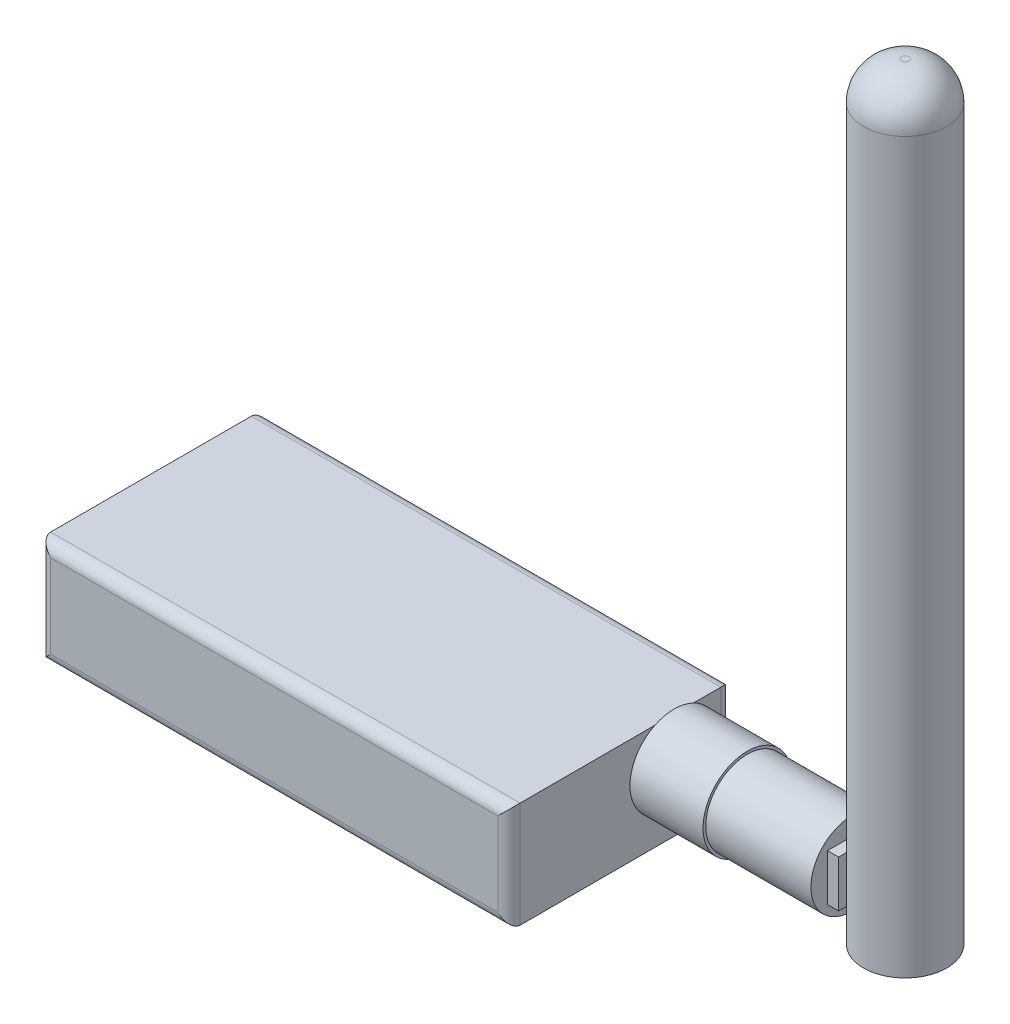
ISO-10303-21;
HEADER;
FILE_DESCRIPTION(('STEP AP214'),'2;1');
FILE_NAME('part.step','',(''),(''),'','','');
FILE_SCHEMA(('AUTOMOTIVE_DESIGN { 1 0 10303 214 1 1 1 1 }'));
ENDSEC;
DATA;
#1=APPLICATION_CONTEXT('core data for automotive mechanical design processes');
#2=APPLICATION_PROTOCOL_DEFINITION('international standard','automotive_design',2000,#1);
#3=PRODUCT_CONTEXT('',#1,'mechanical');
#4=PRODUCT('Part','Part','',(#3));
#5=PRODUCT_RELATED_PRODUCT_CATEGORY('part','',(#4));
#6=PRODUCT_DEFINITION_FORMATION('','',#4);
#7=PRODUCT_DEFINITION_CONTEXT('part definition',#1,'design');
#8=PRODUCT_DEFINITION('design','',#6,#7);
#9=PRODUCT_DEFINITION_SHAPE('','',#8);
#10=(LENGTH_UNIT() NAMED_UNIT(*) SI_UNIT(.MILLI.,.METRE.));
#11=(NAMED_UNIT(*) PLANE_ANGLE_UNIT() SI_UNIT($,.RADIAN.));
#12=(NAMED_UNIT(*) SI_UNIT($,.STERADIAN.) SOLID_ANGLE_UNIT());
#13=UNCERTAINTY_MEASURE_WITH_UNIT(LENGTH_MEASURE(1.E-05),#10,'distance_accuracy_value','');
#14=(GEOMETRIC_REPRESENTATION_CONTEXT(3) GLOBAL_UNCERTAINTY_ASSIGNED_CONTEXT((#13)) GLOBAL_UNIT_ASSIGNED_CONTEXT((#10,
#11,#12)) REPRESENTATION_CONTEXT('',''));
#15=CARTESIAN_POINT('',(0.,0.,0.));
#16=DIRECTION('',(0.,0.,1.));
#17=DIRECTION('',(1.,0.,0.));
#18=AXIS2_PLACEMENT_3D('',#15,#16,#17);
#19=CARTESIAN_POINT('',(53.7608822609412,89.94,-8.128));
#20=DIRECTION('',(0.,-1.,0.));
#21=DIRECTION('',(0.,0.,-1.));
#22=AXIS2_PLACEMENT_3D('',#19,#20,#21);
#23=CYLINDRICAL_SURFACE('',#22,4.74500003499999);
#24=CARTESIAN_POINT('',(53.7608822609412,85.622,-8.128));
#25=DIRECTION('',(0.,1.,0.));
#26=DIRECTION('',(0.,0.,1.));
#27=AXIS2_PLACEMENT_3D('',#24,#25,#26);
#28=CIRCLE('',#27,4.74500003499999);
#29=CARTESIAN_POINT('',(53.7608822609412,85.622,-3.38299996500001));
#30=VERTEX_POINT('',#29);
#31=EDGE_CURVE('E11',#30,#30,#28,.F.);
#32=ORIENTED_EDGE('',*,*,#31,.T.);
#33=EDGE_LOOP('',(#32));
#34=FACE_BOUND('',#33,.T.);
#35=CARTESIAN_POINT('',(53.7608822609412,2.54,-8.128));
#36=DIRECTION('',(0.,1.,0.));
#37=DIRECTION('',(0.,0.,1.));
#38=AXIS2_PLACEMENT_3D('',#35,#36,#37);
#39=CIRCLE('',#38,4.74500003499999);
#40=CARTESIAN_POINT('',(53.7608822609412,2.54,-3.38299996500001));
#41=VERTEX_POINT('',#40);
#42=EDGE_CURVE('E58',#41,#41,#39,.T.);
#43=ORIENTED_EDGE('',*,*,#42,.T.);
#44=EDGE_LOOP('',(#43));
#45=FACE_BOUND('',#44,.T.);
#46=ADVANCED_FACE('F47',(#34,#45),#23,.T.);
#47=CARTESIAN_POINT('',(53.7608822609412,89.94,-8.128));
#48=DIRECTION('',(0.,1.,0.));
#49=DIRECTION('',(0.,0.,1.));
#50=AXIS2_PLACEMENT_3D('',#47,#48,#49);
#51=PLANE('',#50);
#52=CARTESIAN_POINT('',(53.7608822609412,89.94,-8.128));
#53=DIRECTION('',(0.,1.,0.));
#54=DIRECTION('',(0.,0.,1.));
#55=AXIS2_PLACEMENT_3D('',#52,#53,#54);
#56=CIRCLE('',#55,0.427000034999989);
#57=CARTESIAN_POINT('',(53.7608822609412,89.94,-7.70099996500001));
#58=VERTEX_POINT('',#57);
#59=EDGE_CURVE('E54',#58,#58,#56,.T.);
#60=ORIENTED_EDGE('',*,*,#59,.T.);
#61=EDGE_LOOP('',(#60));
#62=FACE_BOUND('',#61,.T.);
#63=ADVANCED_FACE('F68',(#62),#51,.T.);
#64=CARTESIAN_POINT('',(53.7608822609412,2.54,-8.128));
#65=DIRECTION('',(0.,1.,0.));
#66=DIRECTION('',(0.,0.,1.));
#67=AXIS2_PLACEMENT_3D('',#64,#65,#66);
#68=PLANE('',#67);
#69=ORIENTED_EDGE('',*,*,#42,.F.);
#70=EDGE_LOOP('',(#69));
#71=FACE_BOUND('',#70,.T.);
#72=ADVANCED_FACE('F66',(#71),#68,.F.);
#73=CARTESIAN_POINT('',(53.7608822609412,85.622,-8.128));
#74=DIRECTION('',(0.,1.,0.));
#75=DIRECTION('',(0.,0.,1.));
#76=AXIS2_PLACEMENT_3D('',#73,#74,#75);
#77=DEGENERATE_TOROIDAL_SURFACE('',#76,0.427000034999989,4.318,.T.);
#78=ORIENTED_EDGE('',*,*,#31,.F.);
#79=EDGE_LOOP('',(#78));
#80=FACE_BOUND('',#79,.T.);
#81=ORIENTED_EDGE('',*,*,#59,.F.);
#82=EDGE_LOOP('',(#81));
#83=FACE_BOUND('',#82,.T.);
#84=ADVANCED_FACE('F49',(#80,#83),#77,.T.);
#85=CLOSED_SHELL('',(#46,#63,#72,#84));
#86=MANIFOLD_SOLID_BREP('B2',#85);
#87=CARTESIAN_POINT('',(47.7458823529412,7.5138,-8.15131764705882));
#88=DIRECTION('',(1.,0.,0.));
#89=DIRECTION('',(0.,0.,-1.));
#90=AXIS2_PLACEMENT_3D('',#87,#88,#89);
#91=PLANE('',#90);
#92=CARTESIAN_POINT('',(47.7458823529412,7.5138,-8.15131764705882));
#93=DIRECTION('',(1.,0.,0.));
#94=DIRECTION('',(0.,0.,-1.));
#95=AXIS2_PLACEMENT_3D('',#92,#93,#94);
#96=CIRCLE('',#95,4.745);
#97=CARTESIAN_POINT('',(47.7458823529412,7.5138,-12.8963176470588));
#98=VERTEX_POINT('',#97);
#99=EDGE_CURVE('E232',#98,#98,#96,.T.);
#100=ORIENTED_EDGE('',*,*,#99,.T.);
#101=EDGE_LOOP('',(#100));
#102=FACE_BOUND('',#101,.T.);
#103=DIRECTION('',(0.,-1.,0.));
#104=VECTOR('',#103,1.);
#105=CARTESIAN_POINT('',(47.7458823529412,10.1738,-5.29131764705882));
#106=LINE('',#105,#104);
#107=CARTESIAN_POINT('',(47.7458823529412,10.1738,-5.29131764705882));
#108=VERTEX_POINT('',#107);
#109=CARTESIAN_POINT('',(47.7458823529412,4.8538,-5.29131764705882));
#110=VERTEX_POINT('',#109);
#111=EDGE_CURVE('E208',#108,#110,#106,.T.);
#112=ORIENTED_EDGE('',*,*,#111,.F.);
#113=DIRECTION('',(0.,0.,-1.));
#114=VECTOR('',#113,1.);
#115=CARTESIAN_POINT('',(47.7458823529412,10.1738,-5.29131764705882));
#116=LINE('',#115,#114);
#117=CARTESIAN_POINT('',(47.7458823529412,10.1738,-11.0113176470588));
#118=VERTEX_POINT('',#117);
#119=EDGE_CURVE('E120',#108,#118,#116,.T.);
#120=ORIENTED_EDGE('',*,*,#119,.T.);
#121=DIRECTION('',(0.,-1.,0.));
#122=VECTOR('',#121,1.);
#123=CARTESIAN_POINT('',(47.7458823529412,10.1738,-11.0113176470588));
#124=LINE('',#123,#122);
#125=CARTESIAN_POINT('',(47.7458823529412,4.8538,-11.0113176470588));
#126=VERTEX_POINT('',#125);
#127=EDGE_CURVE('E125',#118,#126,#124,.T.);
#128=ORIENTED_EDGE('',*,*,#127,.T.);
#129=DIRECTION('',(0.,0.,-1.));
#130=VECTOR('',#129,1.);
#131=CARTESIAN_POINT('',(47.7458823529412,4.8538,-5.29131764705882));
#132=LINE('',#131,#130);
#133=EDGE_CURVE('E226',#110,#126,#132,.T.);
#134=ORIENTED_EDGE('',*,*,#133,.F.);
#135=EDGE_LOOP('',(#112,#120,#128,#134));
#136=FACE_BOUND('',#135,.T.);
#137=ADVANCED_FACE('F103',(#102,#136),#91,.T.);
#138=CARTESIAN_POINT('',(-26.1041176470588,12.06,-14.7291176470588));
#139=DIRECTION('',(1.,0.,0.));
#140=DIRECTION('',(0.,0.,-1.));
#141=AXIS2_PLACEMENT_3D('',#138,#139,#140);
#142=PLANE('',#141);
#143=DIRECTION('',(0.,0.,1.));
#144=VECTOR('',#143,1.);
#145=CARTESIAN_POINT('',(-26.1041176470588,12.06,-14.7291176470588));
#146=LINE('',#145,#144);
#147=CARTESIAN_POINT('',(-26.1041176470588,12.06,-13.4591176470588));
#148=VERTEX_POINT('',#147);
#149=CARTESIAN_POINT('',(-26.1041176470588,12.06,9.42088235294118));
#150=VERTEX_POINT('',#149);
#151=EDGE_CURVE('E249',#148,#150,#146,.T.);
#152=ORIENTED_EDGE('',*,*,#151,.F.);
#153=DIRECTION('',(0.,-1.,0.));
#154=VECTOR('',#153,1.);
#155=CARTESIAN_POINT('',(-26.1041176470588,0.,-13.4591176470588));
#156=LINE('',#155,#154);
#157=CARTESIAN_POINT('',(-26.1041176470588,0.,-13.4591176470588));
#158=VERTEX_POINT('',#157);
#159=EDGE_CURVE('E302',#148,#158,#156,.T.);
#160=ORIENTED_EDGE('',*,*,#159,.T.);
#161=DIRECTION('',(0.,0.,1.));
#162=VECTOR('',#161,1.);
#163=CARTESIAN_POINT('',(-26.1041176470588,0.,-14.7291176470588));
#164=LINE('',#163,#162);
#165=CARTESIAN_POINT('',(-26.1041176470588,0.,9.42088235294118));
#166=VERTEX_POINT('',#165);
#167=EDGE_CURVE('E243',#158,#166,#164,.T.);
#168=ORIENTED_EDGE('',*,*,#167,.T.);
#169=DIRECTION('',(0.,-1.,0.));
#170=VECTOR('',#169,1.);
#171=CARTESIAN_POINT('',(-26.1041176470588,12.06,9.42088235294118));
#172=LINE('',#171,#170);
#173=EDGE_CURVE('E267',#166,#150,#172,.F.);
#174=ORIENTED_EDGE('',*,*,#173,.T.);
#175=EDGE_LOOP('',(#152,#160,#168,#174));
#176=FACE_BOUND('',#175,.T.);
#177=ADVANCED_FACE('F326',(#176),#142,.F.);
#178=CARTESIAN_POINT('',(-26.1041176470588,12.06,10.6908823529412));
#179=DIRECTION('',(0.,0.,-1.));
#180=DIRECTION('',(-1.,0.,0.));
#181=AXIS2_PLACEMENT_3D('',#178,#179,#180);
#182=PLANE('',#181);
#183=DIRECTION('',(1.,0.,0.));
#184=VECTOR('',#183,1.);
#185=CARTESIAN_POINT('',(-26.1041176470588,10.79,10.6908823529412));
#186=LINE('',#185,#184);
#187=CARTESIAN_POINT('',(26.1458823529412,10.79,10.6908823529412));
#188=VERTEX_POINT('',#187);
#189=CARTESIAN_POINT('',(-24.8341176470588,10.79,10.6908823529412));
#190=VERTEX_POINT('',#189);
#191=EDGE_CURVE('E262',#188,#190,#186,.F.);
#192=ORIENTED_EDGE('',*,*,#191,.T.);
#193=DIRECTION('',(0.,-1.,0.));
#194=VECTOR('',#193,1.);
#195=CARTESIAN_POINT('',(-24.8341176470588,12.06,10.6908823529412));
#196=LINE('',#195,#194);
#197=CARTESIAN_POINT('',(-24.8341176470588,1.27,10.6908823529412));
#198=VERTEX_POINT('',#197);
#199=EDGE_CURVE('E264',#190,#198,#196,.T.);
#200=ORIENTED_EDGE('',*,*,#199,.T.);
#201=DIRECTION('',(1.,0.,0.));
#202=VECTOR('',#201,1.);
#203=CARTESIAN_POINT('',(-26.1041176470588,1.27,10.6908823529412));
#204=LINE('',#203,#202);
#205=CARTESIAN_POINT('',(26.1458823529412,1.27,10.6908823529412));
#206=VERTEX_POINT('',#205);
#207=EDGE_CURVE('E258',#198,#206,#204,.T.);
#208=ORIENTED_EDGE('',*,*,#207,.T.);
#209=DIRECTION('',(0.,-1.,0.));
#210=VECTOR('',#209,1.);
#211=CARTESIAN_POINT('',(26.1458823529412,12.06,10.6908823529412));
#212=LINE('',#211,#210);
#213=EDGE_CURVE('E260',#206,#188,#212,.F.);
#214=ORIENTED_EDGE('',*,*,#213,.T.);
#215=EDGE_LOOP('',(#192,#200,#208,#214));
#216=FACE_BOUND('',#215,.T.);
#217=ADVANCED_FACE('F344',(#216),#182,.F.);
#218=CARTESIAN_POINT('',(27.4158823529412,12.06,-14.7291176470588));
#219=DIRECTION('',(1.,0.,0.));
#220=DIRECTION('',(0.,0.,-1.));
#221=AXIS2_PLACEMENT_3D('',#218,#219,#220);
#222=PLANE('',#221);
#223=DIRECTION('',(0.,0.,1.));
#224=VECTOR('',#223,1.);
#225=CARTESIAN_POINT('',(27.4158823529412,0.,-14.7291176470588));
#226=LINE('',#225,#224);
#227=CARTESIAN_POINT('',(27.4158823529412,0.,-13.4591176470588));
#228=VERTEX_POINT('',#227);
#229=CARTESIAN_POINT('',(27.4158823529412,0.,9.42088235294118));
#230=VERTEX_POINT('',#229);
#231=EDGE_CURVE('E252',#228,#230,#226,.T.);
#232=ORIENTED_EDGE('',*,*,#231,.F.);
#233=DIRECTION('',(0.,-1.,0.));
#234=VECTOR('',#233,1.);
#235=CARTESIAN_POINT('',(27.4158823529412,12.06,-13.4591176470588));
#236=LINE('',#235,#234);
#237=CARTESIAN_POINT('',(27.4158823529412,12.06,-13.4591176470588));
#238=VERTEX_POINT('',#237);
#239=EDGE_CURVE('E297',#228,#238,#236,.F.);
#240=ORIENTED_EDGE('',*,*,#239,.T.);
#241=DIRECTION('',(0.,0.,1.));
#242=VECTOR('',#241,1.);
#243=CARTESIAN_POINT('',(27.4158823529412,12.06,-14.7291176470588));
#244=LINE('',#243,#242);
#245=CARTESIAN_POINT('',(27.4158823529412,12.06,-10.3500822001659));
#246=VERTEX_POINT('',#245);
#247=EDGE_CURVE('E253',#238,#246,#244,.T.);
#248=ORIENTED_EDGE('',*,*,#247,.T.);
#249=CARTESIAN_POINT('',(27.4158823529412,7.5138,-8.15131764705882));
#250=DIRECTION('',(1.,0.,0.));
#251=DIRECTION('',(0.,0.,-1.));
#252=AXIS2_PLACEMENT_3D('',#249,#250,#251);
#253=CIRCLE('',#252,5.05);
#254=CARTESIAN_POINT('',(27.4158823529412,12.06,-5.95255309395178));
#255=VERTEX_POINT('',#254);
#256=EDGE_CURVE('E248',#255,#246,#253,.T.);
#257=ORIENTED_EDGE('',*,*,#256,.F.);
#258=CARTESIAN_POINT('',(27.4158823529412,12.06,9.42088235294118));
#259=VERTEX_POINT('',#258);
#260=EDGE_CURVE('E251',#255,#259,#244,.T.);
#261=ORIENTED_EDGE('',*,*,#260,.T.);
#262=DIRECTION('',(0.,-1.,0.));
#263=VECTOR('',#262,1.);
#264=CARTESIAN_POINT('',(27.4158823529412,0.,9.42088235294118));
#265=LINE('',#264,#263);
#266=EDGE_CURVE('E272',#259,#230,#265,.T.);
#267=ORIENTED_EDGE('',*,*,#266,.T.);
#268=EDGE_LOOP('',(#232,#240,#248,#257,#261,#267));
#269=FACE_BOUND('',#268,.T.);
#270=ADVANCED_FACE('F358',(#269),#222,.T.);
#271=CARTESIAN_POINT('',(-26.1041176470588,12.06,-14.7291176470588));
#272=DIRECTION('',(0.,0.,-1.));
#273=DIRECTION('',(-1.,0.,0.));
#274=AXIS2_PLACEMENT_3D('',#271,#272,#273);
#275=PLANE('',#274);
#276=DIRECTION('',(1.,0.,0.));
#277=VECTOR('',#276,1.);
#278=CARTESIAN_POINT('',(-26.1041176470588,10.79,-14.7291176470588));
#279=LINE('',#278,#277);
#280=CARTESIAN_POINT('',(-24.8341176470588,10.79,-14.7291176470588));
#281=VERTEX_POINT('',#280);
#282=CARTESIAN_POINT('',(26.1458823529412,10.79,-14.7291176470588));
#283=VERTEX_POINT('',#282);
#284=EDGE_CURVE('E292',#281,#283,#279,.T.);
#285=ORIENTED_EDGE('',*,*,#284,.T.);
#286=DIRECTION('',(0.,-1.,0.));
#287=VECTOR('',#286,1.);
#288=CARTESIAN_POINT('',(26.1458823529412,12.06,-14.7291176470588));
#289=LINE('',#288,#287);
#290=CARTESIAN_POINT('',(26.1458823529412,1.27,-14.7291176470588));
#291=VERTEX_POINT('',#290);
#292=EDGE_CURVE('E294',#283,#291,#289,.T.);
#293=ORIENTED_EDGE('',*,*,#292,.T.);
#294=DIRECTION('',(1.,0.,0.));
#295=VECTOR('',#294,1.);
#296=CARTESIAN_POINT('',(-26.1041176470588,1.27,-14.7291176470588));
#297=LINE('',#296,#295);
#298=CARTESIAN_POINT('',(-24.8341176470588,1.27,-14.7291176470588));
#299=VERTEX_POINT('',#298);
#300=EDGE_CURVE('E278',#291,#299,#297,.F.);
#301=ORIENTED_EDGE('',*,*,#300,.T.);
#302=DIRECTION('',(0.,-1.,0.));
#303=VECTOR('',#302,1.);
#304=CARTESIAN_POINT('',(-24.8341176470588,12.06,-14.7291176470588));
#305=LINE('',#304,#303);
#306=EDGE_CURVE('E290',#299,#281,#305,.F.);
#307=ORIENTED_EDGE('',*,*,#306,.T.);
#308=EDGE_LOOP('',(#285,#293,#301,#307));
#309=FACE_BOUND('',#308,.T.);
#310=ADVANCED_FACE('F398',(#309),#275,.T.);
#311=CARTESIAN_POINT('',(0.,12.06,0.));
#312=DIRECTION('',(0.,1.,0.));
#313=DIRECTION('',(0.,0.,1.));
#314=AXIS2_PLACEMENT_3D('',#311,#312,#313);
#315=PLANE('',#314);
#316=ORIENTED_EDGE('',*,*,#247,.F.);
#317=DIRECTION('',(1.,0.,0.));
#318=VECTOR('',#317,1.);
#319=CARTESIAN_POINT('',(0.,12.06,-13.4591176470588));
#320=LINE('',#319,#318);
#321=EDGE_CURVE('E300',#238,#148,#320,.F.);
#322=ORIENTED_EDGE('',*,*,#321,.T.);
#323=ORIENTED_EDGE('',*,*,#151,.T.);
#324=DIRECTION('',(1.,0.,0.));
#325=VECTOR('',#324,1.);
#326=CARTESIAN_POINT('',(27.4158823529412,12.06,9.42088235294118));
#327=LINE('',#326,#325);
#328=EDGE_CURVE('E270',#150,#259,#327,.T.);
#329=ORIENTED_EDGE('',*,*,#328,.T.);
#330=ORIENTED_EDGE('',*,*,#260,.F.);
#331=EDGE_CURVE('E255',#246,#255,#244,.T.);
#332=ORIENTED_EDGE('',*,*,#331,.F.);
#333=EDGE_LOOP('',(#316,#322,#323,#329,#330,#332));
#334=FACE_BOUND('',#333,.T.);
#335=ADVANCED_FACE('F353',(#334),#315,.T.);
#336=CARTESIAN_POINT('',(0.,0.,0.));
#337=DIRECTION('',(0.,1.,0.));
#338=DIRECTION('',(0.,0.,1.));
#339=AXIS2_PLACEMENT_3D('',#336,#337,#338);
#340=PLANE('',#339);
#341=ORIENTED_EDGE('',*,*,#167,.F.);
#342=DIRECTION('',(1.,0.,0.));
#343=VECTOR('',#342,1.);
#344=CARTESIAN_POINT('',(27.4158823529412,0.,-13.4591176470588));
#345=LINE('',#344,#343);
#346=EDGE_CURVE('E112',#158,#228,#345,.T.);
#347=ORIENTED_EDGE('',*,*,#346,.T.);
#348=ORIENTED_EDGE('',*,*,#231,.T.);
#349=DIRECTION('',(1.,0.,0.));
#350=VECTOR('',#349,1.);
#351=CARTESIAN_POINT('',(0.,0.,9.42088235294118));
#352=LINE('',#351,#350);
#353=EDGE_CURVE('E275',#230,#166,#352,.F.);
#354=ORIENTED_EDGE('',*,*,#353,.T.);
#355=EDGE_LOOP('',(#341,#347,#348,#354));
#356=FACE_BOUND('',#355,.T.);
#357=ADVANCED_FACE('F328',(#356),#340,.F.);
#358=CARTESIAN_POINT('',(27.4158823529412,7.5138,-8.15131764705882));
#359=DIRECTION('',(1.,0.,0.));
#360=DIRECTION('',(0.,0.,-1.));
#361=AXIS2_PLACEMENT_3D('',#358,#359,#360);
#362=PLANE('',#361);
#363=EDGE_CURVE('E244',#246,#255,#253,.T.);
#364=ORIENTED_EDGE('',*,*,#363,.F.);
#365=ORIENTED_EDGE('',*,*,#331,.T.);
#366=EDGE_LOOP('',(#364,#365));
#367=FACE_BOUND('',#366,.T.);
#368=ADVANCED_FACE('F389',(#367),#362,.F.);
#369=CARTESIAN_POINT('',(35.7458823529412,7.5138,-8.15131764705882));
#370=DIRECTION('',(-1.,0.,0.));
#371=DIRECTION('',(0.,0.,1.));
#372=AXIS2_PLACEMENT_3D('',#369,#370,#371);
#373=CYLINDRICAL_SURFACE('',#372,5.05);
#374=CARTESIAN_POINT('',(35.7458823529412,7.5138,-8.15131764705882));
#375=DIRECTION('',(1.,0.,0.));
#376=DIRECTION('',(0.,0.,-1.));
#377=AXIS2_PLACEMENT_3D('',#374,#375,#376);
#378=CIRCLE('',#377,5.05);
#379=CARTESIAN_POINT('',(35.7458823529412,7.5138,-13.2013176470588));
#380=VERTEX_POINT('',#379);
#381=EDGE_CURVE('E240',#380,#380,#378,.T.);
#382=ORIENTED_EDGE('',*,*,#381,.F.);
#383=EDGE_LOOP('',(#382));
#384=FACE_BOUND('',#383,.T.);
#385=ORIENTED_EDGE('',*,*,#363,.T.);
#386=ORIENTED_EDGE('',*,*,#256,.T.);
#387=EDGE_LOOP('',(#385,#386));
#388=FACE_BOUND('',#387,.T.);
#389=ADVANCED_FACE('F370',(#384,#388),#373,.T.);
#390=CARTESIAN_POINT('',(35.7458823529412,7.5138,-8.15131764705882));
#391=DIRECTION('',(1.,0.,0.));
#392=DIRECTION('',(0.,0.,-1.));
#393=AXIS2_PLACEMENT_3D('',#390,#391,#392);
#394=PLANE('',#393);
#395=CARTESIAN_POINT('',(35.7458823529412,7.5138,-8.15131764705882));
#396=DIRECTION('',(1.,0.,0.));
#397=DIRECTION('',(0.,0.,-1.));
#398=AXIS2_PLACEMENT_3D('',#395,#396,#397);
#399=CIRCLE('',#398,4.745);
#400=CARTESIAN_POINT('',(35.7458823529412,7.5138,-12.8963176470588));
#401=VERTEX_POINT('',#400);
#402=EDGE_CURVE('E45',#401,#401,#399,.T.);
#403=ORIENTED_EDGE('',*,*,#402,.F.);
#404=EDGE_LOOP('',(#403));
#405=FACE_BOUND('',#404,.T.);
#406=ORIENTED_EDGE('',*,*,#381,.T.);
#407=EDGE_LOOP('',(#406));
#408=FACE_BOUND('',#407,.T.);
#409=ADVANCED_FACE('F363',(#405,#408),#394,.T.);
#410=CARTESIAN_POINT('',(26.1458823529412,12.06,9.42088235294118));
#411=DIRECTION('',(0.,1.,0.));
#412=DIRECTION('',(0.,0.,1.));
#413=AXIS2_PLACEMENT_3D('',#410,#411,#412);
#414=CYLINDRICAL_SURFACE('',#413,1.27);
#415=CARTESIAN_POINT('',(26.1458823529412,1.27,9.42088235294118));
#416=DIRECTION('',(0.707106781186547,0.707106781186547,0.));
#417=DIRECTION('',(0.707106781186547,-0.707106781186547,0.));
#418=AXIS2_PLACEMENT_3D('',#415,#416,#417);
#419=ELLIPSE('',#418,1.79605122421383,1.27);
#420=EDGE_CURVE('E284',#230,#206,#419,.F.);
#421=ORIENTED_EDGE('',*,*,#420,.F.);
#422=ORIENTED_EDGE('',*,*,#266,.F.);
#423=CARTESIAN_POINT('',(26.1458823529412,10.79,9.42088235294118));
#424=DIRECTION('',(-0.707106781186547,0.707106781186547,0.));
#425=DIRECTION('',(0.707106781186547,0.707106781186547,0.));
#426=AXIS2_PLACEMENT_3D('',#423,#424,#425);
#427=ELLIPSE('',#426,1.79605122421383,1.27);
#428=EDGE_CURVE('E247',#188,#259,#427,.T.);
#429=ORIENTED_EDGE('',*,*,#428,.F.);
#430=ORIENTED_EDGE('',*,*,#213,.F.);
#431=EDGE_LOOP('',(#421,#422,#429,#430));
#432=FACE_BOUND('',#431,.T.);
#433=ADVANCED_FACE('F361',(#432),#414,.T.);
#434=CARTESIAN_POINT('',(0.,10.79,9.42088235294118));
#435=DIRECTION('',(-1.,0.,0.));
#436=DIRECTION('',(0.,0.,1.));
#437=AXIS2_PLACEMENT_3D('',#434,#435,#436);
#438=CYLINDRICAL_SURFACE('',#437,1.27);
#439=ORIENTED_EDGE('',*,*,#428,.T.);
#440=ORIENTED_EDGE('',*,*,#328,.F.);
#441=CARTESIAN_POINT('',(-24.8341176470588,10.79,9.42088235294118));
#442=DIRECTION('',(-0.707106781186547,-0.707106781186547,0.));
#443=DIRECTION('',(-0.707106781186547,0.707106781186547,0.));
#444=AXIS2_PLACEMENT_3D('',#441,#442,#443);
#445=ELLIPSE('',#444,1.79605122421383,1.27);
#446=EDGE_CURVE('E281',#190,#150,#445,.T.);
#447=ORIENTED_EDGE('',*,*,#446,.F.);
#448=ORIENTED_EDGE('',*,*,#191,.F.);
#449=EDGE_LOOP('',(#439,#440,#447,#448));
#450=FACE_BOUND('',#449,.T.);
#451=ADVANCED_FACE('F348',(#450),#438,.T.);
#452=CARTESIAN_POINT('',(-26.1041176470588,1.27,9.42088235294118));
#453=DIRECTION('',(1.,0.,0.));
#454=DIRECTION('',(0.,0.,-1.));
#455=AXIS2_PLACEMENT_3D('',#452,#453,#454);
#456=CYLINDRICAL_SURFACE('',#455,1.27);
#457=ORIENTED_EDGE('',*,*,#420,.T.);
#458=ORIENTED_EDGE('',*,*,#207,.F.);
#459=CARTESIAN_POINT('',(-24.8341176470588,1.27,9.42088235294118));
#460=DIRECTION('',(0.707106781186547,-0.707106781186547,0.));
#461=DIRECTION('',(0.707106781186547,0.707106781186547,0.));
#462=AXIS2_PLACEMENT_3D('',#459,#460,#461);
#463=ELLIPSE('',#462,1.79605122421383,1.27);
#464=EDGE_CURVE('E279',#166,#198,#463,.F.);
#465=ORIENTED_EDGE('',*,*,#464,.F.);
#466=ORIENTED_EDGE('',*,*,#353,.F.);
#467=EDGE_LOOP('',(#457,#458,#465,#466));
#468=FACE_BOUND('',#467,.T.);
#469=ADVANCED_FACE('F340',(#468),#456,.T.);
#470=CARTESIAN_POINT('',(-24.8341176470588,12.06,9.42088235294118));
#471=DIRECTION('',(0.,-1.,0.));
#472=DIRECTION('',(0.,0.,-1.));
#473=AXIS2_PLACEMENT_3D('',#470,#471,#472);
#474=CYLINDRICAL_SURFACE('',#473,1.27);
#475=ORIENTED_EDGE('',*,*,#446,.T.);
#476=ORIENTED_EDGE('',*,*,#173,.F.);
#477=ORIENTED_EDGE('',*,*,#464,.T.);
#478=ORIENTED_EDGE('',*,*,#199,.F.);
#479=EDGE_LOOP('',(#475,#476,#477,#478));
#480=FACE_BOUND('',#479,.T.);
#481=ADVANCED_FACE('F335',(#480),#474,.T.);
#482=CARTESIAN_POINT('',(-24.8341176470588,12.06,-13.4591176470588));
#483=DIRECTION('',(0.,1.,0.));
#484=DIRECTION('',(0.,0.,1.));
#485=AXIS2_PLACEMENT_3D('',#482,#483,#484);
#486=CYLINDRICAL_SURFACE('',#485,1.27);
#487=CARTESIAN_POINT('',(-24.8341176470588,1.27,-13.4591176470588));
#488=DIRECTION('',(-0.707106781186547,0.707106781186547,0.));
#489=DIRECTION('',(-0.707106781186547,-0.707106781186547,0.));
#490=AXIS2_PLACEMENT_3D('',#487,#488,#489);
#491=ELLIPSE('',#490,1.79605122421383,1.27);
#492=EDGE_CURVE('E307',#158,#299,#491,.F.);
#493=ORIENTED_EDGE('',*,*,#492,.F.);
#494=ORIENTED_EDGE('',*,*,#159,.F.);
#495=CARTESIAN_POINT('',(-24.8341176470588,10.79,-13.4591176470588));
#496=DIRECTION('',(0.707106781186547,0.707106781186547,0.));
#497=DIRECTION('',(-0.707106781186547,0.707106781186547,0.));
#498=AXIS2_PLACEMENT_3D('',#495,#496,#497);
#499=ELLIPSE('',#498,1.79605122421383,1.27);
#500=EDGE_CURVE('E107',#281,#148,#499,.T.);
#501=ORIENTED_EDGE('',*,*,#500,.F.);
#502=ORIENTED_EDGE('',*,*,#306,.F.);
#503=EDGE_LOOP('',(#493,#494,#501,#502));
#504=FACE_BOUND('',#503,.T.);
#505=ADVANCED_FACE('F105',(#504),#486,.T.);
#506=CARTESIAN_POINT('',(-26.1041176470588,10.79,-13.4591176470588));
#507=DIRECTION('',(1.,0.,0.));
#508=DIRECTION('',(0.,0.,-1.));
#509=AXIS2_PLACEMENT_3D('',#506,#507,#508);
#510=CYLINDRICAL_SURFACE('',#509,1.27);
#511=ORIENTED_EDGE('',*,*,#500,.T.);
#512=ORIENTED_EDGE('',*,*,#321,.F.);
#513=CARTESIAN_POINT('',(26.1458823529412,10.79,-13.4591176470588));
#514=DIRECTION('',(0.707106781186547,-0.707106781186547,0.));
#515=DIRECTION('',(0.707106781186547,0.707106781186547,0.));
#516=AXIS2_PLACEMENT_3D('',#513,#514,#515);
#517=ELLIPSE('',#516,1.79605122421383,1.27);
#518=EDGE_CURVE('E306',#283,#238,#517,.T.);
#519=ORIENTED_EDGE('',*,*,#518,.F.);
#520=ORIENTED_EDGE('',*,*,#284,.F.);
#521=EDGE_LOOP('',(#511,#512,#519,#520));
#522=FACE_BOUND('',#521,.T.);
#523=ADVANCED_FACE('F318',(#522),#510,.T.);
#524=CARTESIAN_POINT('',(0.,1.27,-13.4591176470588));
#525=DIRECTION('',(-1.,0.,0.));
#526=DIRECTION('',(0.,0.,1.));
#527=AXIS2_PLACEMENT_3D('',#524,#525,#526);
#528=CYLINDRICAL_SURFACE('',#527,1.27);
#529=ORIENTED_EDGE('',*,*,#492,.T.);
#530=ORIENTED_EDGE('',*,*,#300,.F.);
#531=CARTESIAN_POINT('',(26.1458823529412,1.27,-13.4591176470588));
#532=DIRECTION('',(-0.707106781186547,-0.707106781186547,0.));
#533=DIRECTION('',(-0.707106781186547,0.707106781186547,0.));
#534=AXIS2_PLACEMENT_3D('',#531,#532,#533);
#535=ELLIPSE('',#534,1.79605122421383,1.27);
#536=EDGE_CURVE('E238',#228,#291,#535,.F.);
#537=ORIENTED_EDGE('',*,*,#536,.F.);
#538=ORIENTED_EDGE('',*,*,#346,.F.);
#539=EDGE_LOOP('',(#529,#530,#537,#538));
#540=FACE_BOUND('',#539,.T.);
#541=ADVANCED_FACE('F432',(#540),#528,.T.);
#542=CARTESIAN_POINT('',(26.1458823529412,12.06,-13.4591176470588));
#543=DIRECTION('',(0.,-1.,0.));
#544=DIRECTION('',(0.,0.,-1.));
#545=AXIS2_PLACEMENT_3D('',#542,#543,#544);
#546=CYLINDRICAL_SURFACE('',#545,1.27);
#547=ORIENTED_EDGE('',*,*,#518,.T.);
#548=ORIENTED_EDGE('',*,*,#239,.F.);
#549=ORIENTED_EDGE('',*,*,#536,.T.);
#550=ORIENTED_EDGE('',*,*,#292,.F.);
#551=EDGE_LOOP('',(#547,#548,#549,#550));
#552=FACE_BOUND('',#551,.T.);
#553=ADVANCED_FACE('F386',(#552),#546,.T.);
#554=CARTESIAN_POINT('',(47.7458823529412,7.5138,-8.15131764705882));
#555=DIRECTION('',(-1.,0.,0.));
#556=DIRECTION('',(0.,0.,1.));
#557=AXIS2_PLACEMENT_3D('',#554,#555,#556);
#558=CYLINDRICAL_SURFACE('',#557,4.745);
#559=ORIENTED_EDGE('',*,*,#99,.F.);
#560=EDGE_LOOP('',(#559));
#561=FACE_BOUND('',#560,.T.);
#562=ORIENTED_EDGE('',*,*,#402,.T.);
#563=EDGE_LOOP('',(#562));
#564=FACE_BOUND('',#563,.T.);
#565=ADVANCED_FACE('F384',(#561,#564),#558,.T.);
#566=CARTESIAN_POINT('',(49.0158823529412,10.1738,-5.29131764705882));
#567=DIRECTION('',(0.,1.,0.));
#568=DIRECTION('',(0.,0.,1.));
#569=AXIS2_PLACEMENT_3D('',#566,#567,#568);
#570=PLANE('',#569);
#571=ORIENTED_EDGE('',*,*,#119,.F.);
#572=DIRECTION('',(-1.,0.,0.));
#573=VECTOR('',#572,1.);
#574=CARTESIAN_POINT('',(49.0158823529412,10.1738,-5.29131764705882));
#575=LINE('',#574,#573);
#576=CARTESIAN_POINT('',(49.0158823529412,10.1738,-5.29131764705882));
#577=VERTEX_POINT('',#576);
#578=EDGE_CURVE('E203',#577,#108,#575,.T.);
#579=ORIENTED_EDGE('',*,*,#578,.F.);
#580=DIRECTION('',(0.,0.,-1.));
#581=VECTOR('',#580,1.);
#582=CARTESIAN_POINT('',(49.0158823529412,10.1738,-5.29131764705882));
#583=LINE('',#582,#581);
#584=CARTESIAN_POINT('',(49.0158823529412,10.1738,-11.0113176470588));
#585=VERTEX_POINT('',#584);
#586=EDGE_CURVE('E198',#577,#585,#583,.T.);
#587=ORIENTED_EDGE('',*,*,#586,.T.);
#588=DIRECTION('',(-1.,0.,0.));
#589=VECTOR('',#588,1.);
#590=CARTESIAN_POINT('',(49.0158823529412,10.1738,-11.0113176470588));
#591=LINE('',#590,#589);
#592=EDGE_CURVE('E201',#585,#118,#591,.T.);
#593=ORIENTED_EDGE('',*,*,#592,.T.);
#594=EDGE_LOOP('',(#571,#579,#587,#593));
#595=FACE_BOUND('',#594,.T.);
#596=ADVANCED_FACE('F200',(#595),#570,.T.);
#597=CARTESIAN_POINT('',(49.0158823529412,10.1738,-5.29131764705882));
#598=DIRECTION('',(0.,0.,-1.));
#599=DIRECTION('',(0.,1.,0.));
#600=AXIS2_PLACEMENT_3D('',#597,#598,#599);
#601=PLANE('',#600);
#602=ORIENTED_EDGE('',*,*,#111,.T.);
#603=DIRECTION('',(-1.,0.,0.));
#604=VECTOR('',#603,1.);
#605=CARTESIAN_POINT('',(49.0158823529412,4.8538,-5.29131764705882));
#606=LINE('',#605,#604);
#607=CARTESIAN_POINT('',(49.0158823529412,4.8538,-5.29131764705882));
#608=VERTEX_POINT('',#607);
#609=EDGE_CURVE('E233',#608,#110,#606,.T.);
#610=ORIENTED_EDGE('',*,*,#609,.F.);
#611=DIRECTION('',(0.,-1.,0.));
#612=VECTOR('',#611,1.);
#613=CARTESIAN_POINT('',(49.0158823529412,10.1738,-5.29131764705882));
#614=LINE('',#613,#612);
#615=EDGE_CURVE('E214',#577,#608,#614,.T.);
#616=ORIENTED_EDGE('',*,*,#615,.F.);
#617=ORIENTED_EDGE('',*,*,#578,.T.);
#618=EDGE_LOOP('',(#602,#610,#616,#617));
#619=FACE_BOUND('',#618,.T.);
#620=ADVANCED_FACE('F455',(#619),#601,.F.);
#621=CARTESIAN_POINT('',(49.0158823529412,4.8538,-5.29131764705882));
#622=DIRECTION('',(0.,1.,0.));
#623=DIRECTION('',(0.,0.,1.));
#624=AXIS2_PLACEMENT_3D('',#621,#622,#623);
#625=PLANE('',#624);
#626=ORIENTED_EDGE('',*,*,#133,.T.);
#627=DIRECTION('',(-1.,0.,0.));
#628=VECTOR('',#627,1.);
#629=CARTESIAN_POINT('',(49.0158823529412,4.8538,-11.0113176470588));
#630=LINE('',#629,#628);
#631=CARTESIAN_POINT('',(49.0158823529412,4.8538,-11.0113176470588));
#632=VERTEX_POINT('',#631);
#633=EDGE_CURVE('E213',#632,#126,#630,.T.);
#634=ORIENTED_EDGE('',*,*,#633,.F.);
#635=DIRECTION('',(0.,0.,-1.));
#636=VECTOR('',#635,1.);
#637=CARTESIAN_POINT('',(49.0158823529412,4.8538,-5.29131764705882));
#638=LINE('',#637,#636);
#639=EDGE_CURVE('E218',#608,#632,#638,.T.);
#640=ORIENTED_EDGE('',*,*,#639,.F.);
#641=ORIENTED_EDGE('',*,*,#609,.T.);
#642=EDGE_LOOP('',(#626,#634,#640,#641));
#643=FACE_BOUND('',#642,.T.);
#644=ADVANCED_FACE('F461',(#643),#625,.F.);
#645=CARTESIAN_POINT('',(49.0158823529412,10.1738,-11.0113176470588));
#646=DIRECTION('',(0.,0.,-1.));
#647=DIRECTION('',(-1.,0.,0.));
#648=AXIS2_PLACEMENT_3D('',#645,#646,#647);
#649=PLANE('',#648);
#650=ORIENTED_EDGE('',*,*,#127,.F.);
#651=ORIENTED_EDGE('',*,*,#592,.F.);
#652=DIRECTION('',(0.,-1.,0.));
#653=VECTOR('',#652,1.);
#654=CARTESIAN_POINT('',(49.0158823529412,10.1738,-11.0113176470588));
#655=LINE('',#654,#653);
#656=EDGE_CURVE('E207',#585,#632,#655,.T.);
#657=ORIENTED_EDGE('',*,*,#656,.T.);
#658=ORIENTED_EDGE('',*,*,#633,.T.);
#659=EDGE_LOOP('',(#650,#651,#657,#658));
#660=FACE_BOUND('',#659,.T.);
#661=ADVANCED_FACE('F212',(#660),#649,.T.);
#662=CARTESIAN_POINT('',(49.0158823529412,0.,0.));
#663=DIRECTION('',(-1.,0.,0.));
#664=DIRECTION('',(0.,0.,1.));
#665=AXIS2_PLACEMENT_3D('',#662,#663,#664);
#666=PLANE('',#665);
#667=ORIENTED_EDGE('',*,*,#639,.T.);
#668=ORIENTED_EDGE('',*,*,#656,.F.);
#669=ORIENTED_EDGE('',*,*,#586,.F.);
#670=ORIENTED_EDGE('',*,*,#615,.T.);
#671=EDGE_LOOP('',(#667,#668,#669,#670));
#672=FACE_BOUND('',#671,.T.);
#673=ADVANCED_FACE('F216',(#672),#666,.F.);
#674=CLOSED_SHELL('',(#137,#177,#217,#270,#310,#335,#357,#368,#389,#409,#433,#451,#469,#481,
#505,#523,#541,#553,#565,#596,#620,#644,#661,#673));
#675=MANIFOLD_SOLID_BREP('B6',#674);
#676=ADVANCED_BREP_SHAPE_REPRESENTATION('',(#18,#86,#675),#14);
#677=SHAPE_DEFINITION_REPRESENTATION(#9,#676);
ENDSEC;
END-ISO-10303-21;
